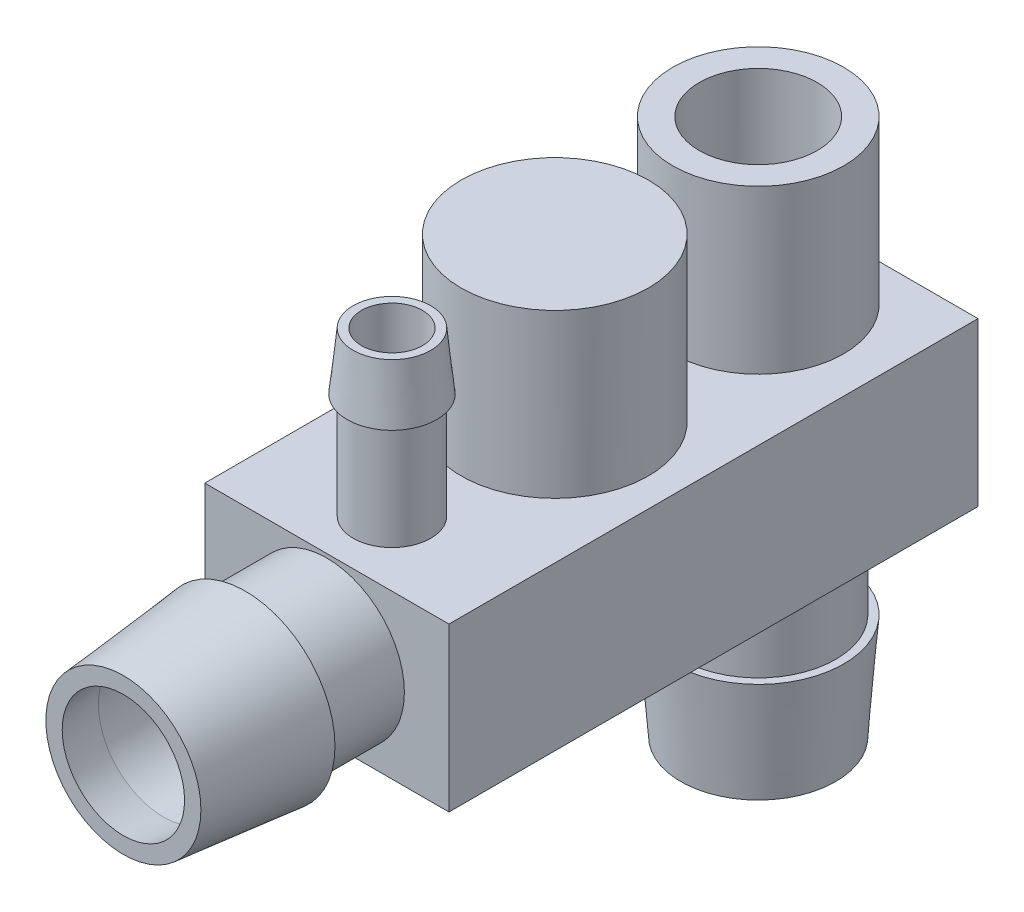
ISO-10303-21;
HEADER;
FILE_DESCRIPTION(('STEP AP214'),'2;1');
FILE_NAME('part.step','',(''),(''),'','','');
FILE_SCHEMA(('AUTOMOTIVE_DESIGN { 1 0 10303 214 1 1 1 1 }'));
ENDSEC;
DATA;
#1=APPLICATION_CONTEXT('core data for automotive mechanical design processes');
#2=APPLICATION_PROTOCOL_DEFINITION('international standard','automotive_design',2000,#1);
#3=PRODUCT_CONTEXT('',#1,'mechanical');
#4=PRODUCT('Part','Part','',(#3));
#5=PRODUCT_RELATED_PRODUCT_CATEGORY('part','',(#4));
#6=PRODUCT_DEFINITION_FORMATION('','',#4);
#7=PRODUCT_DEFINITION_CONTEXT('part definition',#1,'design');
#8=PRODUCT_DEFINITION('design','',#6,#7);
#9=PRODUCT_DEFINITION_SHAPE('','',#8);
#10=(LENGTH_UNIT() NAMED_UNIT(*) SI_UNIT(.MILLI.,.METRE.));
#11=(NAMED_UNIT(*) PLANE_ANGLE_UNIT() SI_UNIT($,.RADIAN.));
#12=(NAMED_UNIT(*) SI_UNIT($,.STERADIAN.) SOLID_ANGLE_UNIT());
#13=UNCERTAINTY_MEASURE_WITH_UNIT(LENGTH_MEASURE(1.E-05),#10,'distance_accuracy_value','');
#14=(GEOMETRIC_REPRESENTATION_CONTEXT(3) GLOBAL_UNCERTAINTY_ASSIGNED_CONTEXT((#13)) GLOBAL_UNIT_ASSIGNED_CONTEXT((#10,
#11,#12)) REPRESENTATION_CONTEXT('',''));
#15=CARTESIAN_POINT('',(0.,0.,0.));
#16=DIRECTION('',(0.,0.,1.));
#17=DIRECTION('',(1.,0.,0.));
#18=AXIS2_PLACEMENT_3D('',#15,#16,#17);
#19=CARTESIAN_POINT('',(0.,5.,4.49999999999999));
#20=DIRECTION('',(0.,1.,0.));
#21=DIRECTION('',(0.,0.,1.));
#22=AXIS2_PLACEMENT_3D('',#19,#20,#21);
#23=CYLINDRICAL_SURFACE('',#22,9.525);
#24=CARTESIAN_POINT('',(0.,8.,4.49999999999999));
#25=DIRECTION('',(0.,-1.,0.));
#26=DIRECTION('',(0.,0.,-1.));
#27=AXIS2_PLACEMENT_3D('',#24,#25,#26);
#28=CIRCLE('',#27,9.525);
#29=CARTESIAN_POINT('',(0.,8.,-5.02500000000001));
#30=VERTEX_POINT('',#29);
#31=EDGE_CURVE('E424',#30,#30,#28,.T.);
#32=ORIENTED_EDGE('',*,*,#31,.T.);
#33=EDGE_LOOP('',(#32));
#34=FACE_BOUND('',#33,.T.);
#35=CARTESIAN_POINT('',(0.,27.85,4.49999999999999));
#36=DIRECTION('',(0.,1.,0.));
#37=DIRECTION('',(0.,0.,1.));
#38=AXIS2_PLACEMENT_3D('',#35,#36,#37);
#39=CIRCLE('',#38,9.525);
#40=CARTESIAN_POINT('',(0.,27.85,14.025));
#41=VERTEX_POINT('',#40);
#42=EDGE_CURVE('E12',#41,#41,#39,.F.);
#43=ORIENTED_EDGE('',*,*,#42,.F.);
#44=EDGE_LOOP('',(#43));
#45=FACE_BOUND('',#44,.T.);
#46=ADVANCED_FACE('F40',(#34,#45),#23,.F.);
#47=CARTESIAN_POINT('',(0.,-36.,-20.5));
#48=DIRECTION('',(0.,1.,0.));
#49=DIRECTION('',(0.,0.,1.));
#50=AXIS2_PLACEMENT_3D('',#47,#48,#49);
#51=CYLINDRICAL_SURFACE('',#50,9.525);
#52=CARTESIAN_POINT('',(0.,-10.,-20.5));
#53=DIRECTION('',(0.,1.,0.));
#54=DIRECTION('',(0.,0.,1.));
#55=AXIS2_PLACEMENT_3D('',#52,#53,#54);
#56=CIRCLE('',#55,9.525);
#57=CARTESIAN_POINT('',(0.,-10.,-10.975));
#58=VERTEX_POINT('',#57);
#59=EDGE_CURVE('E202',#58,#58,#56,.F.);
#60=CARTESIAN_POINT('',(0.,-23.,-20.5));
#61=DIRECTION('',(0.,-1.,0.));
#62=DIRECTION('',(0.,0.,-1.));
#63=AXIS2_PLACEMENT_3D('',#60,#61,#62);
#64=CIRCLE('',#63,9.525);
#65=CARTESIAN_POINT('',(0.,-23.,-10.975));
#66=VERTEX_POINT('',#65);
#67=EDGE_CURVE('E48',#66,#66,#64,.T.);
#68=CARTESIAN_POINT('',(0.,-10.,-10.975));
#69=CARTESIAN_POINT('',(0.,-10.1354166666667,-10.975));
#70=CARTESIAN_POINT('',(0.,-10.2708333333333,-10.975));
#71=CARTESIAN_POINT('',(0.,-10.5416666666667,-10.975));
#72=CARTESIAN_POINT('',(0.,-10.6770833333333,-10.975));
#73=CARTESIAN_POINT('',(0.,-10.9479166666667,-10.975));
#74=CARTESIAN_POINT('',(0.,-11.0833333333333,-10.975));
#75=CARTESIAN_POINT('',(0.,-11.3541666666667,-10.975));
#76=CARTESIAN_POINT('',(0.,-11.4895833333333,-10.975));
#77=CARTESIAN_POINT('',(0.,-11.7604166666667,-10.975));
#78=CARTESIAN_POINT('',(0.,-11.8958333333333,-10.975));
#79=CARTESIAN_POINT('',(0.,-12.1666666666667,-10.975));
#80=CARTESIAN_POINT('',(0.,-12.3020833333333,-10.975));
#81=CARTESIAN_POINT('',(0.,-12.5729166666667,-10.975));
#82=CARTESIAN_POINT('',(0.,-12.7083333333333,-10.975));
#83=CARTESIAN_POINT('',(0.,-12.9791666666667,-10.975));
#84=CARTESIAN_POINT('',(0.,-13.1145833333333,-10.975));
#85=CARTESIAN_POINT('',(0.,-13.3854166666667,-10.975));
#86=CARTESIAN_POINT('',(0.,-13.5208333333333,-10.975));
#87=CARTESIAN_POINT('',(0.,-13.7916666666667,-10.975));
#88=CARTESIAN_POINT('',(0.,-13.9270833333333,-10.975));
#89=CARTESIAN_POINT('',(0.,-14.1979166666667,-10.975));
#90=CARTESIAN_POINT('',(0.,-14.3333333333333,-10.975));
#91=CARTESIAN_POINT('',(0.,-14.6041666666667,-10.975));
#92=CARTESIAN_POINT('',(0.,-14.7395833333333,-10.975));
#93=CARTESIAN_POINT('',(0.,-15.0104166666667,-10.975));
#94=CARTESIAN_POINT('',(0.,-15.1458333333333,-10.975));
#95=CARTESIAN_POINT('',(0.,-15.4166666666667,-10.975));
#96=CARTESIAN_POINT('',(0.,-15.5520833333333,-10.975));
#97=CARTESIAN_POINT('',(0.,-15.8229166666667,-10.975));
#98=CARTESIAN_POINT('',(0.,-15.9583333333333,-10.975));
#99=CARTESIAN_POINT('',(0.,-16.2291666666667,-10.975));
#100=CARTESIAN_POINT('',(0.,-16.3645833333333,-10.975));
#101=CARTESIAN_POINT('',(0.,-16.6354166666667,-10.975));
#102=CARTESIAN_POINT('',(0.,-16.7708333333333,-10.975));
#103=CARTESIAN_POINT('',(0.,-17.0416666666667,-10.975));
#104=CARTESIAN_POINT('',(0.,-17.1770833333333,-10.975));
#105=CARTESIAN_POINT('',(0.,-17.4479166666667,-10.975));
#106=CARTESIAN_POINT('',(0.,-17.5833333333333,-10.975));
#107=CARTESIAN_POINT('',(0.,-17.8541666666667,-10.975));
#108=CARTESIAN_POINT('',(0.,-17.9895833333333,-10.975));
#109=CARTESIAN_POINT('',(0.,-18.2604166666667,-10.975));
#110=CARTESIAN_POINT('',(0.,-18.3958333333333,-10.975));
#111=CARTESIAN_POINT('',(0.,-18.6666666666667,-10.975));
#112=CARTESIAN_POINT('',(0.,-18.8020833333333,-10.975));
#113=CARTESIAN_POINT('',(0.,-19.0729166666667,-10.975));
#114=CARTESIAN_POINT('',(0.,-19.2083333333333,-10.975));
#115=CARTESIAN_POINT('',(0.,-19.4791666666667,-10.975));
#116=CARTESIAN_POINT('',(0.,-19.6145833333333,-10.975));
#117=CARTESIAN_POINT('',(0.,-19.8854166666667,-10.975));
#118=CARTESIAN_POINT('',(0.,-20.0208333333333,-10.975));
#119=CARTESIAN_POINT('',(0.,-20.2916666666667,-10.975));
#120=CARTESIAN_POINT('',(0.,-20.4270833333333,-10.975));
#121=CARTESIAN_POINT('',(0.,-20.6979166666667,-10.975));
#122=CARTESIAN_POINT('',(0.,-20.8333333333333,-10.975));
#123=CARTESIAN_POINT('',(0.,-21.1041666666667,-10.975));
#124=CARTESIAN_POINT('',(0.,-21.2395833333333,-10.975));
#125=CARTESIAN_POINT('',(0.,-21.5104166666667,-10.975));
#126=CARTESIAN_POINT('',(0.,-21.6458333333333,-10.975));
#127=CARTESIAN_POINT('',(0.,-21.9166666666667,-10.975));
#128=CARTESIAN_POINT('',(0.,-22.0520833333333,-10.975));
#129=CARTESIAN_POINT('',(0.,-22.3229166666667,-10.975));
#130=CARTESIAN_POINT('',(0.,-22.4583333333333,-10.975));
#131=CARTESIAN_POINT('',(0.,-22.7291666666667,-10.975));
#132=CARTESIAN_POINT('',(0.,-22.8645833333333,-10.975));
#133=CARTESIAN_POINT('',(0.,-23.,-10.975));
#134=B_SPLINE_CURVE_WITH_KNOTS('',3,(#68,#69,#70,#71,#72,#73,#74,#75,#76,#77,#78,#79,#80,#81,
#82,#83,#84,#85,#86,#87,#88,#89,#90,#91,#92,#93,#94,#95,#96,#97,#98,#99,#100,#101,#102,#103,
#104,#105,#106,#107,#108,#109,#110,#111,#112,#113,#114,#115,#116,#117,#118,#119,#120,#121,#122,
#123,#124,#125,#126,#127,#128,#129,#130,#131,#132,#133),.UNSPECIFIED.,.F.,.F.,(4,2,2,2,2,2,2,2,
2,2,2,2,2,2,2,2,2,2,2,2,2,2,2,2,2,2,2,2,2,2,2,2,4),(0.,0.40625,0.812500000000001,1.21875,1.625,
2.03125,2.4375,2.84375,3.25,3.65625,4.0625,4.46875,4.875,5.28125,5.6875,6.09375,6.5,6.90625,
7.3125,7.71875,8.125,8.53125,8.93749999999999,9.34375,9.74999999999999,10.15625,10.5625,
10.96875,11.375,11.78125,12.1875,12.59375,13.),.UNSPECIFIED.);
#135=EDGE_CURVE('BSEAM255',#58,#66,#134,.T.);
#136=ORIENTED_EDGE('',*,*,#59,.T.);
#137=ORIENTED_EDGE('',*,*,#67,.F.);
#138=ORIENTED_EDGE('',*,*,#135,.T.);
#139=ORIENTED_EDGE('',*,*,#135,.F.);
#140=EDGE_LOOP('',(#136,#138,#137,#139));
#141=FACE_BOUND('',#140,.T.);
#142=ADVANCED_FACE('F255',(#141),#51,.T.);
#143=CARTESIAN_POINT('',(0.,1.,-20.5));
#144=DIRECTION('',(0.,-1.,0.));
#145=DIRECTION('',(0.,0.,-1.));
#146=AXIS2_PLACEMENT_3D('',#143,#144,#145);
#147=CYLINDRICAL_SURFACE('',#146,8.5);
#148=CARTESIAN_POINT('',(0.,-8.,-20.5));
#149=DIRECTION('',(0.,1.,0.));
#150=DIRECTION('',(0.,0.,1.));
#151=AXIS2_PLACEMENT_3D('',#148,#149,#150);
#152=CIRCLE('',#151,8.5);
#153=CARTESIAN_POINT('',(0.,-8.,-12.));
#154=VERTEX_POINT('',#153);
#155=EDGE_CURVE('E216',#154,#154,#152,.T.);
#156=ORIENTED_EDGE('',*,*,#155,.T.);
#157=EDGE_LOOP('',(#156));
#158=FACE_BOUND('',#157,.T.);
#159=CARTESIAN_POINT('',(0.,-23.,-20.5));
#160=DIRECTION('',(0.,-1.,0.));
#161=DIRECTION('',(0.,0.,-1.));
#162=AXIS2_PLACEMENT_3D('',#159,#160,#161);
#163=CIRCLE('',#162,8.5);
#164=CARTESIAN_POINT('',(0.,-23.,-29.));
#165=VERTEX_POINT('',#164);
#166=EDGE_CURVE('E204',#165,#165,#163,.F.);
#167=ORIENTED_EDGE('',*,*,#166,.F.);
#168=EDGE_LOOP('',(#167));
#169=FACE_BOUND('',#168,.T.);
#170=ADVANCED_FACE('F284',(#158,#169),#147,.F.);
#171=CARTESIAN_POINT('',(0.,30.,24.5));
#172=DIRECTION('',(0.,-1.,0.));
#173=DIRECTION('',(0.,0.,-1.));
#174=AXIS2_PLACEMENT_3D('',#171,#172,#173);
#175=CYLINDRICAL_SURFACE('',#174,4.7625);
#176=CARTESIAN_POINT('',(0.,10.,24.5));
#177=DIRECTION('',(0.,-1.,0.));
#178=DIRECTION('',(0.,0.,-1.));
#179=AXIS2_PLACEMENT_3D('',#176,#177,#178);
#180=CIRCLE('',#179,4.7625);
#181=CARTESIAN_POINT('',(0.,10.,19.7375));
#182=VERTEX_POINT('',#181);
#183=EDGE_CURVE('E190',#182,#182,#180,.F.);
#184=ORIENTED_EDGE('',*,*,#183,.T.);
#185=EDGE_LOOP('',(#184));
#186=FACE_BOUND('',#185,.T.);
#187=CARTESIAN_POINT('',(0.,23.,24.5));
#188=DIRECTION('',(0.,1.,0.));
#189=DIRECTION('',(0.,0.,1.));
#190=AXIS2_PLACEMENT_3D('',#187,#188,#189);
#191=CIRCLE('',#190,4.7625);
#192=CARTESIAN_POINT('',(0.,23.,29.2625));
#193=VERTEX_POINT('',#192);
#194=EDGE_CURVE('E199',#193,#193,#191,.T.);
#195=ORIENTED_EDGE('',*,*,#194,.F.);
#196=EDGE_LOOP('',(#195));
#197=FACE_BOUND('',#196,.T.);
#198=ADVANCED_FACE('F281',(#186,#197),#175,.T.);
#199=CARTESIAN_POINT('',(0.,0.,30.5));
#200=DIRECTION('',(0.,0.,1.));
#201=DIRECTION('',(1.,0.,0.));
#202=AXIS2_PLACEMENT_3D('',#199,#200,#201);
#203=CYLINDRICAL_SURFACE('',#202,8.);
#204=CARTESIAN_POINT('',(0.,0.,30.5));
#205=DIRECTION('',(0.,0.,1.));
#206=DIRECTION('',(1.,0.,0.));
#207=AXIS2_PLACEMENT_3D('',#204,#205,#206);
#208=CIRCLE('',#207,8.);
#209=CARTESIAN_POINT('',(0.,8.,30.5));
#210=VERTEX_POINT('',#209);
#211=CARTESIAN_POINT('',(0.,-8.,30.5));
#212=VERTEX_POINT('',#211);
#213=EDGE_CURVE('E54',#210,#212,#208,.T.);
#214=ORIENTED_EDGE('',*,*,#213,.F.);
#215=EDGE_CURVE('E130',#212,#210,#208,.T.);
#216=ORIENTED_EDGE('',*,*,#215,.F.);
#217=EDGE_LOOP('',(#214,#216));
#218=FACE_BOUND('',#217,.T.);
#219=CARTESIAN_POINT('',(0.,0.,52.5713947569169));
#220=DIRECTION('',(0.,0.,-1.));
#221=DIRECTION('',(-1.,0.,0.));
#222=AXIS2_PLACEMENT_3D('',#219,#220,#221);
#223=CIRCLE('',#222,8.);
#224=CARTESIAN_POINT('',(-8.,0.,52.5713947569169));
#225=VERTEX_POINT('',#224);
#226=EDGE_CURVE('E164',#225,#225,#223,.T.);
#227=ORIENTED_EDGE('',*,*,#226,.F.);
#228=EDGE_LOOP('',(#227));
#229=FACE_BOUND('',#228,.T.);
#230=ADVANCED_FACE('F131',(#218,#229),#203,.F.);
#231=CARTESIAN_POINT('',(0.,0.,30.5));
#232=DIRECTION('',(0.,0.,1.));
#233=DIRECTION('',(1.,0.,0.));
#234=AXIS2_PLACEMENT_3D('',#231,#232,#233);
#235=PLANE('',#234);
#236=DIRECTION('',(-1.,0.,0.));
#237=VECTOR('',#236,1.);
#238=CARTESIAN_POINT('',(-15.,8.,30.5));
#239=LINE('',#238,#237);
#240=CARTESIAN_POINT('',(-13.,8.,30.5));
#241=VERTEX_POINT('',#240);
#242=EDGE_CURVE('E144',#210,#241,#239,.T.);
#243=ORIENTED_EDGE('',*,*,#242,.F.);
#244=ORIENTED_EDGE('',*,*,#213,.T.);
#245=DIRECTION('',(1.,0.,0.));
#246=VECTOR('',#245,1.);
#247=CARTESIAN_POINT('',(-15.,-8.,30.5));
#248=LINE('',#247,#246);
#249=CARTESIAN_POINT('',(-13.,-8.,30.5));
#250=VERTEX_POINT('',#249);
#251=EDGE_CURVE('E143',#250,#212,#248,.T.);
#252=ORIENTED_EDGE('',*,*,#251,.F.);
#253=DIRECTION('',(0.,-1.,0.));
#254=VECTOR('',#253,1.);
#255=CARTESIAN_POINT('',(-13.,10.,30.5));
#256=LINE('',#255,#254);
#257=EDGE_CURVE('E155',#241,#250,#256,.T.);
#258=ORIENTED_EDGE('',*,*,#257,.F.);
#259=EDGE_LOOP('',(#243,#244,#252,#258));
#260=FACE_BOUND('',#259,.T.);
#261=ADVANCED_FACE('F140',(#260),#235,.F.);
#262=CARTESIAN_POINT('',(13.,10.,32.5));
#263=DIRECTION('',(-1.,0.,0.));
#264=DIRECTION('',(0.,0.,1.));
#265=AXIS2_PLACEMENT_3D('',#262,#263,#264);
#266=PLANE('',#265);
#267=DIRECTION('',(0.,1.,0.));
#268=VECTOR('',#267,1.);
#269=CARTESIAN_POINT('',(13.,10.,-30.5));
#270=LINE('',#269,#268);
#271=CARTESIAN_POINT('',(13.,-8.,-30.5));
#272=VERTEX_POINT('',#271);
#273=CARTESIAN_POINT('',(13.,8.,-30.5));
#274=VERTEX_POINT('',#273);
#275=EDGE_CURVE('E186',#272,#274,#270,.T.);
#276=ORIENTED_EDGE('',*,*,#275,.F.);
#277=DIRECTION('',(0.,0.,-1.));
#278=VECTOR('',#277,1.);
#279=CARTESIAN_POINT('',(13.,-8.,32.5));
#280=LINE('',#279,#278);
#281=CARTESIAN_POINT('',(13.,-8.,30.5));
#282=VERTEX_POINT('',#281);
#283=EDGE_CURVE('E184',#282,#272,#280,.T.);
#284=ORIENTED_EDGE('',*,*,#283,.F.);
#285=DIRECTION('',(0.,1.,0.));
#286=VECTOR('',#285,1.);
#287=CARTESIAN_POINT('',(13.,10.,30.5));
#288=LINE('',#287,#286);
#289=CARTESIAN_POINT('',(13.,8.,30.5));
#290=VERTEX_POINT('',#289);
#291=EDGE_CURVE('E151',#282,#290,#288,.T.);
#292=ORIENTED_EDGE('',*,*,#291,.T.);
#293=DIRECTION('',(0.,0.,-1.));
#294=VECTOR('',#293,1.);
#295=CARTESIAN_POINT('',(13.,8.,32.5));
#296=LINE('',#295,#294);
#297=EDGE_CURVE('E181',#290,#274,#296,.T.);
#298=ORIENTED_EDGE('',*,*,#297,.T.);
#299=EDGE_LOOP('',(#276,#284,#292,#298));
#300=FACE_BOUND('',#299,.T.);
#301=ADVANCED_FACE('F379',(#300),#266,.T.);
#302=CARTESIAN_POINT('',(-15.,8.,32.5));
#303=DIRECTION('',(0.,-1.,0.));
#304=DIRECTION('',(0.,0.,-1.));
#305=AXIS2_PLACEMENT_3D('',#302,#303,#304);
#306=PLANE('',#305);
#307=CARTESIAN_POINT('',(0.,8.,24.5));
#308=DIRECTION('',(0.,-1.,0.));
#309=DIRECTION('',(0.,0.,-1.));
#310=AXIS2_PLACEMENT_3D('',#307,#308,#309);
#311=CIRCLE('',#310,3.75);
#312=CARTESIAN_POINT('',(0.,8.,20.75));
#313=VERTEX_POINT('',#312);
#314=EDGE_CURVE('E421',#313,#313,#311,.T.);
#315=ORIENTED_EDGE('',*,*,#314,.F.);
#316=EDGE_LOOP('',(#315));
#317=FACE_BOUND('',#316,.T.);
#318=ORIENTED_EDGE('',*,*,#31,.F.);
#319=EDGE_LOOP('',(#318));
#320=FACE_BOUND('',#319,.T.);
#321=CARTESIAN_POINT('',(0.,8.,-20.5));
#322=DIRECTION('',(0.,-1.,0.));
#323=DIRECTION('',(0.,0.,-1.));
#324=AXIS2_PLACEMENT_3D('',#321,#322,#323);
#325=CIRCLE('',#324,7.25);
#326=CARTESIAN_POINT('',(0.,8.,-27.75));
#327=VERTEX_POINT('',#326);
#328=EDGE_CURVE('E427',#327,#327,#325,.T.);
#329=ORIENTED_EDGE('',*,*,#328,.F.);
#330=EDGE_LOOP('',(#329));
#331=FACE_BOUND('',#330,.T.);
#332=DIRECTION('',(-1.,0.,0.));
#333=VECTOR('',#332,1.);
#334=CARTESIAN_POINT('',(-15.,8.,-30.5));
#335=LINE('',#334,#333);
#336=CARTESIAN_POINT('',(-13.,8.,-30.5));
#337=VERTEX_POINT('',#336);
#338=EDGE_CURVE('E63',#274,#337,#335,.T.);
#339=ORIENTED_EDGE('',*,*,#338,.F.);
#340=ORIENTED_EDGE('',*,*,#297,.F.);
#341=EDGE_CURVE('E171',#290,#210,#239,.T.);
#342=ORIENTED_EDGE('',*,*,#341,.T.);
#343=ORIENTED_EDGE('',*,*,#242,.T.);
#344=DIRECTION('',(0.,0.,-1.));
#345=VECTOR('',#344,1.);
#346=CARTESIAN_POINT('',(-13.,8.,32.5));
#347=LINE('',#346,#345);
#348=EDGE_CURVE('E177',#241,#337,#347,.T.);
#349=ORIENTED_EDGE('',*,*,#348,.T.);
#350=EDGE_LOOP('',(#339,#340,#342,#343,#349));
#351=FACE_BOUND('',#350,.T.);
#352=ADVANCED_FACE('F382',(#317,#320,#331,#351),#306,.T.);
#353=CARTESIAN_POINT('',(-13.,10.,32.5));
#354=DIRECTION('',(1.,0.,0.));
#355=DIRECTION('',(0.,1.,0.));
#356=AXIS2_PLACEMENT_3D('',#353,#354,#355);
#357=PLANE('',#356);
#358=DIRECTION('',(0.,-1.,0.));
#359=VECTOR('',#358,1.);
#360=CARTESIAN_POINT('',(-13.,10.,-30.5));
#361=LINE('',#360,#359);
#362=CARTESIAN_POINT('',(-13.,-8.,-30.5));
#363=VERTEX_POINT('',#362);
#364=EDGE_CURVE('E179',#337,#363,#361,.T.);
#365=ORIENTED_EDGE('',*,*,#364,.F.);
#366=ORIENTED_EDGE('',*,*,#348,.F.);
#367=ORIENTED_EDGE('',*,*,#257,.T.);
#368=DIRECTION('',(0.,0.,-1.));
#369=VECTOR('',#368,1.);
#370=CARTESIAN_POINT('',(-13.,-8.,32.5));
#371=LINE('',#370,#369);
#372=EDGE_CURVE('E161',#250,#363,#371,.T.);
#373=ORIENTED_EDGE('',*,*,#372,.T.);
#374=EDGE_LOOP('',(#365,#366,#367,#373));
#375=FACE_BOUND('',#374,.T.);
#376=ADVANCED_FACE('F386',(#375),#357,.T.);
#377=CARTESIAN_POINT('',(-15.,-8.,32.5));
#378=DIRECTION('',(0.,1.,0.));
#379=DIRECTION('',(0.,0.,1.));
#380=AXIS2_PLACEMENT_3D('',#377,#378,#379);
#381=PLANE('',#380);
#382=ORIENTED_EDGE('',*,*,#155,.F.);
#383=EDGE_LOOP('',(#382));
#384=FACE_BOUND('',#383,.T.);
#385=DIRECTION('',(1.,0.,0.));
#386=VECTOR('',#385,1.);
#387=CARTESIAN_POINT('',(-15.,-8.,-30.5));
#388=LINE('',#387,#386);
#389=EDGE_CURVE('E175',#363,#272,#388,.T.);
#390=ORIENTED_EDGE('',*,*,#389,.F.);
#391=ORIENTED_EDGE('',*,*,#372,.F.);
#392=ORIENTED_EDGE('',*,*,#251,.T.);
#393=EDGE_CURVE('E148',#212,#282,#248,.T.);
#394=ORIENTED_EDGE('',*,*,#393,.T.);
#395=ORIENTED_EDGE('',*,*,#283,.T.);
#396=EDGE_LOOP('',(#390,#391,#392,#394,#395));
#397=FACE_BOUND('',#396,.T.);
#398=ADVANCED_FACE('F159',(#384,#397),#381,.T.);
#399=ORIENTED_EDGE('',*,*,#393,.F.);
#400=ORIENTED_EDGE('',*,*,#215,.T.);
#401=ORIENTED_EDGE('',*,*,#341,.F.);
#402=ORIENTED_EDGE('',*,*,#291,.F.);
#403=EDGE_LOOP('',(#399,#400,#401,#402));
#404=FACE_BOUND('',#403,.T.);
#405=ADVANCED_FACE('F149',(#404),#235,.F.);
#406=CARTESIAN_POINT('',(0.,0.,-30.5));
#407=DIRECTION('',(0.,0.,1.));
#408=DIRECTION('',(1.,0.,0.));
#409=AXIS2_PLACEMENT_3D('',#406,#407,#408);
#410=PLANE('',#409);
#411=ORIENTED_EDGE('',*,*,#275,.T.);
#412=ORIENTED_EDGE('',*,*,#338,.T.);
#413=ORIENTED_EDGE('',*,*,#364,.T.);
#414=ORIENTED_EDGE('',*,*,#389,.T.);
#415=EDGE_LOOP('',(#411,#412,#413,#414));
#416=FACE_BOUND('',#415,.T.);
#417=ADVANCED_FACE('F42',(#416),#410,.T.);
#418=CARTESIAN_POINT('',(0.,0.,57.304277321645));
#419=DIRECTION('',(0.,0.,-1.));
#420=DIRECTION('',(-1.,0.,0.));
#421=AXIS2_PLACEMENT_3D('',#418,#419,#420);
#422=CONICAL_SURFACE('',#421,7.53459988113507,0.0980182166238236);
#423=CARTESIAN_POINT('',(0.,0.,57.5));
#424=DIRECTION('',(0.,0.,1.));
#425=DIRECTION('',(1.,0.,0.));
#426=AXIS2_PLACEMENT_3D('',#423,#424,#425);
#427=CIRCLE('',#426,7.51535381776349);
#428=CARTESIAN_POINT('',(7.51535381776349,0.,57.5));
#429=VERTEX_POINT('',#428);
#430=EDGE_CURVE('E326',#429,#429,#427,.F.);
#431=ORIENTED_EDGE('',*,*,#430,.F.);
#432=EDGE_LOOP('',(#431));
#433=FACE_BOUND('',#432,.T.);
#434=ORIENTED_EDGE('',*,*,#226,.T.);
#435=EDGE_LOOP('',(#434));
#436=FACE_BOUND('',#435,.T.);
#437=ADVANCED_FACE('F286',(#433,#436),#422,.F.);
#438=CARTESIAN_POINT('',(0.,0.,57.5));
#439=DIRECTION('',(0.,0.,1.));
#440=DIRECTION('',(1.,0.,0.));
#441=AXIS2_PLACEMENT_3D('',#438,#439,#440);
#442=PLANE('',#441);
#443=CARTESIAN_POINT('',(0.,0.,57.5));
#444=DIRECTION('',(0.,0.,1.));
#445=DIRECTION('',(1.,0.,0.));
#446=AXIS2_PLACEMENT_3D('',#443,#444,#445);
#447=CIRCLE('',#446,9.525);
#448=CARTESIAN_POINT('',(9.525,0.,57.5));
#449=VERTEX_POINT('',#448);
#450=EDGE_CURVE('E318',#449,#449,#447,.F.);
#451=ORIENTED_EDGE('',*,*,#450,.F.);
#452=EDGE_LOOP('',(#451));
#453=FACE_BOUND('',#452,.T.);
#454=ORIENTED_EDGE('',*,*,#430,.T.);
#455=EDGE_LOOP('',(#454));
#456=FACE_BOUND('',#455,.T.);
#457=ADVANCED_FACE('F289',(#453,#456),#442,.T.);
#458=CARTESIAN_POINT('',(0.,0.,42.5));
#459=DIRECTION('',(0.,0.,1.));
#460=DIRECTION('',(1.,0.,0.));
#461=AXIS2_PLACEMENT_3D('',#458,#459,#460);
#462=PLANE('',#461);
#463=CARTESIAN_POINT('',(0.,0.,42.5));
#464=DIRECTION('',(0.,0.,1.));
#465=DIRECTION('',(1.,0.,0.));
#466=AXIS2_PLACEMENT_3D('',#463,#464,#465);
#467=CIRCLE('',#466,9.525);
#468=CARTESIAN_POINT('',(9.525,0.,42.5));
#469=VERTEX_POINT('',#468);
#470=EDGE_CURVE('E162',#469,#469,#467,.T.);
#471=ORIENTED_EDGE('',*,*,#470,.T.);
#472=EDGE_LOOP('',(#471));
#473=FACE_BOUND('',#472,.T.);
#474=CARTESIAN_POINT('',(0.,0.,42.5));
#475=DIRECTION('',(0.,0.,1.));
#476=DIRECTION('',(1.,0.,0.));
#477=AXIS2_PLACEMENT_3D('',#474,#475,#476);
#478=CIRCLE('',#477,11.);
#479=CARTESIAN_POINT('',(11.,0.,42.5));
#480=VERTEX_POINT('',#479);
#481=EDGE_CURVE('E314',#480,#480,#478,.T.);
#482=ORIENTED_EDGE('',*,*,#481,.F.);
#483=EDGE_LOOP('',(#482));
#484=FACE_BOUND('',#483,.T.);
#485=ADVANCED_FACE('F291',(#473,#484),#462,.F.);
#486=CARTESIAN_POINT('',(0.,0.,57.5));
#487=DIRECTION('',(0.,0.,-1.));
#488=DIRECTION('',(-1.,0.,0.));
#489=AXIS2_PLACEMENT_3D('',#486,#487,#488);
#490=CONICAL_SURFACE('',#489,9.525,0.0980182166238236);
#491=ORIENTED_EDGE('',*,*,#450,.T.);
#492=EDGE_LOOP('',(#491));
#493=FACE_BOUND('',#492,.T.);
#494=ORIENTED_EDGE('',*,*,#481,.T.);
#495=EDGE_LOOP('',(#494));
#496=FACE_BOUND('',#495,.T.);
#497=ADVANCED_FACE('F295',(#493,#496),#490,.T.);
#498=CARTESIAN_POINT('',(0.,0.,-32.5));
#499=DIRECTION('',(0.,0.,1.));
#500=DIRECTION('',(1.,0.,0.));
#501=AXIS2_PLACEMENT_3D('',#498,#499,#500);
#502=PLANE('',#501);
#503=DIRECTION('',(0.,1.,0.));
#504=VECTOR('',#503,1.);
#505=CARTESIAN_POINT('',(15.,10.,-32.5));
#506=LINE('',#505,#504);
#507=CARTESIAN_POINT('',(15.,-10.,-32.5));
#508=VERTEX_POINT('',#507);
#509=CARTESIAN_POINT('',(15.,10.,-32.5));
#510=VERTEX_POINT('',#509);
#511=EDGE_CURVE('E146',#508,#510,#506,.T.);
#512=ORIENTED_EDGE('',*,*,#511,.F.);
#513=DIRECTION('',(1.,0.,0.));
#514=VECTOR('',#513,1.);
#515=CARTESIAN_POINT('',(-15.,-10.,-32.5));
#516=LINE('',#515,#514);
#517=CARTESIAN_POINT('',(-15.,-10.,-32.5));
#518=VERTEX_POINT('',#517);
#519=EDGE_CURVE('E120',#518,#508,#516,.T.);
#520=ORIENTED_EDGE('',*,*,#519,.F.);
#521=DIRECTION('',(0.,-1.,0.));
#522=VECTOR('',#521,1.);
#523=CARTESIAN_POINT('',(-15.,10.,-32.5));
#524=LINE('',#523,#522);
#525=CARTESIAN_POINT('',(-15.,10.,-32.5));
#526=VERTEX_POINT('',#525);
#527=EDGE_CURVE('E114',#526,#518,#524,.T.);
#528=ORIENTED_EDGE('',*,*,#527,.F.);
#529=DIRECTION('',(-1.,0.,0.));
#530=VECTOR('',#529,1.);
#531=CARTESIAN_POINT('',(-15.,10.,-32.5));
#532=LINE('',#531,#530);
#533=EDGE_CURVE('E341',#510,#526,#532,.T.);
#534=ORIENTED_EDGE('',*,*,#533,.F.);
#535=EDGE_LOOP('',(#512,#520,#528,#534));
#536=FACE_BOUND('',#535,.T.);
#537=ADVANCED_FACE('F356',(#536),#502,.F.);
#538=CARTESIAN_POINT('',(-15.,-10.,32.5));
#539=DIRECTION('',(0.,1.,0.));
#540=DIRECTION('',(0.,0.,1.));
#541=AXIS2_PLACEMENT_3D('',#538,#539,#540);
#542=PLANE('',#541);
#543=ORIENTED_EDGE('',*,*,#59,.F.);
#544=EDGE_LOOP('',(#543));
#545=FACE_BOUND('',#544,.T.);
#546=ORIENTED_EDGE('',*,*,#519,.T.);
#547=DIRECTION('',(0.,0.,-1.));
#548=VECTOR('',#547,1.);
#549=CARTESIAN_POINT('',(15.,-10.,32.5));
#550=LINE('',#549,#548);
#551=CARTESIAN_POINT('',(15.,-10.,32.5));
#552=VERTEX_POINT('',#551);
#553=EDGE_CURVE('E338',#552,#508,#550,.T.);
#554=ORIENTED_EDGE('',*,*,#553,.F.);
#555=DIRECTION('',(1.,0.,0.));
#556=VECTOR('',#555,1.);
#557=CARTESIAN_POINT('',(-15.,-10.,32.5));
#558=LINE('',#557,#556);
#559=CARTESIAN_POINT('',(-15.,-10.,32.5));
#560=VERTEX_POINT('',#559);
#561=EDGE_CURVE('E96',#560,#552,#558,.T.);
#562=ORIENTED_EDGE('',*,*,#561,.F.);
#563=DIRECTION('',(0.,0.,-1.));
#564=VECTOR('',#563,1.);
#565=CARTESIAN_POINT('',(-15.,-10.,32.5));
#566=LINE('',#565,#564);
#567=EDGE_CURVE('E346',#560,#518,#566,.T.);
#568=ORIENTED_EDGE('',*,*,#567,.T.);
#569=EDGE_LOOP('',(#546,#554,#562,#568));
#570=FACE_BOUND('',#569,.T.);
#571=ADVANCED_FACE('F358',(#545,#570),#542,.F.);
#572=CARTESIAN_POINT('',(-15.,10.,32.5));
#573=DIRECTION('',(1.,0.,0.));
#574=DIRECTION('',(0.,1.,0.));
#575=AXIS2_PLACEMENT_3D('',#572,#573,#574);
#576=PLANE('',#575);
#577=ORIENTED_EDGE('',*,*,#527,.T.);
#578=ORIENTED_EDGE('',*,*,#567,.F.);
#579=DIRECTION('',(0.,-1.,0.));
#580=VECTOR('',#579,1.);
#581=CARTESIAN_POINT('',(-15.,10.,32.5));
#582=LINE('',#581,#580);
#583=CARTESIAN_POINT('',(-15.,10.,32.5));
#584=VERTEX_POINT('',#583);
#585=EDGE_CURVE('E335',#584,#560,#582,.T.);
#586=ORIENTED_EDGE('',*,*,#585,.F.);
#587=DIRECTION('',(0.,0.,-1.));
#588=VECTOR('',#587,1.);
#589=CARTESIAN_POINT('',(-15.,10.,32.5));
#590=LINE('',#589,#588);
#591=EDGE_CURVE('E347',#584,#526,#590,.T.);
#592=ORIENTED_EDGE('',*,*,#591,.T.);
#593=EDGE_LOOP('',(#577,#578,#586,#592));
#594=FACE_BOUND('',#593,.T.);
#595=ADVANCED_FACE('F364',(#594),#576,.F.);
#596=CARTESIAN_POINT('',(-15.,10.,32.5));
#597=DIRECTION('',(0.,-1.,0.));
#598=DIRECTION('',(0.,0.,-1.));
#599=AXIS2_PLACEMENT_3D('',#596,#597,#598);
#600=PLANE('',#599);
#601=CARTESIAN_POINT('',(0.,10.,-20.5));
#602=DIRECTION('',(0.,-1.,0.));
#603=DIRECTION('',(0.,0.,-1.));
#604=AXIS2_PLACEMENT_3D('',#601,#602,#603);
#605=CIRCLE('',#604,10.5);
#606=CARTESIAN_POINT('',(0.,10.,-31.));
#607=VERTEX_POINT('',#606);
#608=EDGE_CURVE('E196',#607,#607,#605,.F.);
#609=ORIENTED_EDGE('',*,*,#608,.F.);
#610=EDGE_LOOP('',(#609));
#611=FACE_BOUND('',#610,.T.);
#612=CARTESIAN_POINT('',(0.,10.,4.49999999999999));
#613=DIRECTION('',(0.,-1.,0.));
#614=DIRECTION('',(0.,0.,-1.));
#615=AXIS2_PLACEMENT_3D('',#612,#613,#614);
#616=CIRCLE('',#615,11.5);
#617=CARTESIAN_POINT('',(0.,10.,-7.00000000000001));
#618=VERTEX_POINT('',#617);
#619=EDGE_CURVE('E193',#618,#618,#616,.F.);
#620=ORIENTED_EDGE('',*,*,#619,.F.);
#621=EDGE_LOOP('',(#620));
#622=FACE_BOUND('',#621,.T.);
#623=ORIENTED_EDGE('',*,*,#183,.F.);
#624=EDGE_LOOP('',(#623));
#625=FACE_BOUND('',#624,.T.);
#626=ORIENTED_EDGE('',*,*,#533,.T.);
#627=ORIENTED_EDGE('',*,*,#591,.F.);
#628=DIRECTION('',(-1.,0.,0.));
#629=VECTOR('',#628,1.);
#630=CARTESIAN_POINT('',(-15.,10.,32.5));
#631=LINE('',#630,#629);
#632=CARTESIAN_POINT('',(15.,10.,32.5));
#633=VERTEX_POINT('',#632);
#634=EDGE_CURVE('E128',#633,#584,#631,.T.);
#635=ORIENTED_EDGE('',*,*,#634,.F.);
#636=DIRECTION('',(0.,0.,-1.));
#637=VECTOR('',#636,1.);
#638=CARTESIAN_POINT('',(15.,10.,32.5));
#639=LINE('',#638,#637);
#640=EDGE_CURVE('E168',#633,#510,#639,.T.);
#641=ORIENTED_EDGE('',*,*,#640,.T.);
#642=EDGE_LOOP('',(#626,#627,#635,#641));
#643=FACE_BOUND('',#642,.T.);
#644=ADVANCED_FACE('F350',(#611,#622,#625,#643),#600,.F.);
#645=CARTESIAN_POINT('',(15.,10.,32.5));
#646=DIRECTION('',(-1.,0.,0.));
#647=DIRECTION('',(0.,0.,1.));
#648=AXIS2_PLACEMENT_3D('',#645,#646,#647);
#649=PLANE('',#648);
#650=ORIENTED_EDGE('',*,*,#511,.T.);
#651=ORIENTED_EDGE('',*,*,#640,.F.);
#652=DIRECTION('',(0.,1.,0.));
#653=VECTOR('',#652,1.);
#654=CARTESIAN_POINT('',(15.,10.,32.5));
#655=LINE('',#654,#653);
#656=EDGE_CURVE('E332',#552,#633,#655,.T.);
#657=ORIENTED_EDGE('',*,*,#656,.F.);
#658=ORIENTED_EDGE('',*,*,#553,.T.);
#659=EDGE_LOOP('',(#650,#651,#657,#658));
#660=FACE_BOUND('',#659,.T.);
#661=ADVANCED_FACE('F354',(#660),#649,.F.);
#662=CARTESIAN_POINT('',(0.,0.,32.5));
#663=DIRECTION('',(0.,0.,1.));
#664=DIRECTION('',(1.,0.,0.));
#665=AXIS2_PLACEMENT_3D('',#662,#663,#664);
#666=PLANE('',#665);
#667=ORIENTED_EDGE('',*,*,#656,.T.);
#668=ORIENTED_EDGE('',*,*,#634,.T.);
#669=ORIENTED_EDGE('',*,*,#585,.T.);
#670=ORIENTED_EDGE('',*,*,#561,.T.);
#671=EDGE_LOOP('',(#667,#668,#669,#670));
#672=FACE_BOUND('',#671,.T.);
#673=CARTESIAN_POINT('',(0.,0.,32.5));
#674=DIRECTION('',(0.,0.,1.));
#675=DIRECTION('',(1.,0.,0.));
#676=AXIS2_PLACEMENT_3D('',#673,#674,#675);
#677=CIRCLE('',#676,9.525);
#678=CARTESIAN_POINT('',(9.525,0.,32.5));
#679=VERTEX_POINT('',#678);
#680=EDGE_CURVE('E136',#679,#679,#677,.T.);
#681=ORIENTED_EDGE('',*,*,#680,.F.);
#682=EDGE_LOOP('',(#681));
#683=FACE_BOUND('',#682,.T.);
#684=ADVANCED_FACE('F369',(#672,#683),#666,.T.);
#685=CARTESIAN_POINT('',(0.,0.,57.5));
#686=DIRECTION('',(0.,0.,-1.));
#687=DIRECTION('',(-1.,0.,0.));
#688=AXIS2_PLACEMENT_3D('',#685,#686,#687);
#689=CYLINDRICAL_SURFACE('',#688,9.525);
#690=ORIENTED_EDGE('',*,*,#680,.T.);
#691=EDGE_LOOP('',(#690));
#692=FACE_BOUND('',#691,.T.);
#693=ORIENTED_EDGE('',*,*,#470,.F.);
#694=EDGE_LOOP('',(#693));
#695=FACE_BOUND('',#694,.T.);
#696=ADVANCED_FACE('F279',(#692,#695),#689,.T.);
#697=CARTESIAN_POINT('',(0.,30.,24.5));
#698=DIRECTION('',(0.,1.,0.));
#699=DIRECTION('',(0.,0.,1.));
#700=AXIS2_PLACEMENT_3D('',#697,#698,#699);
#701=PLANE('',#700);
#702=CARTESIAN_POINT('',(0.,30.,24.5));
#703=DIRECTION('',(0.,1.,0.));
#704=DIRECTION('',(0.,0.,1.));
#705=AXIS2_PLACEMENT_3D('',#702,#703,#704);
#706=CIRCLE('',#705,4.7625);
#707=CARTESIAN_POINT('',(4.09317800842647,30.,26.9346046991932));
#708=VERTEX_POINT('',#707);
#709=EDGE_CURVE('E219',#708,#708,#706,.F.);
#710=ORIENTED_EDGE('',*,*,#709,.F.);
#711=EDGE_LOOP('',(#710));
#712=FACE_BOUND('',#711,.T.);
#713=CARTESIAN_POINT('',(0.,30.,24.5));
#714=DIRECTION('',(0.,1.,0.));
#715=DIRECTION('',(0.,0.,1.));
#716=AXIS2_PLACEMENT_3D('',#713,#714,#715);
#717=CIRCLE('',#716,3.75);
#718=CARTESIAN_POINT('',(0.,30.,28.25));
#719=VERTEX_POINT('',#718);
#720=EDGE_CURVE('E430',#719,#719,#717,.T.);
#721=ORIENTED_EDGE('',*,*,#720,.F.);
#722=EDGE_LOOP('',(#721));
#723=FACE_BOUND('',#722,.T.);
#724=ADVANCED_FACE('F275',(#712,#723),#701,.T.);
#725=CARTESIAN_POINT('',(0.,30.,4.49999999999999));
#726=DIRECTION('',(0.,-1.,0.));
#727=DIRECTION('',(0.,0.,-1.));
#728=AXIS2_PLACEMENT_3D('',#725,#726,#727);
#729=CYLINDRICAL_SURFACE('',#728,11.5);
#730=CARTESIAN_POINT('',(0.,30.,4.49999999999999));
#731=DIRECTION('',(0.,1.,0.));
#732=DIRECTION('',(0.,0.,1.));
#733=AXIS2_PLACEMENT_3D('',#730,#731,#732);
#734=CIRCLE('',#733,11.5);
#735=CARTESIAN_POINT('',(0.,30.,16.));
#736=VERTEX_POINT('',#735);
#737=EDGE_CURVE('E414',#736,#736,#734,.T.);
#738=ORIENTED_EDGE('',*,*,#737,.F.);
#739=EDGE_LOOP('',(#738));
#740=FACE_BOUND('',#739,.T.);
#741=ORIENTED_EDGE('',*,*,#619,.T.);
#742=EDGE_LOOP('',(#741));
#743=FACE_BOUND('',#742,.T.);
#744=ADVANCED_FACE('F271',(#740,#743),#729,.T.);
#745=CARTESIAN_POINT('',(0.,30.,4.49999999999999));
#746=DIRECTION('',(0.,1.,0.));
#747=DIRECTION('',(0.,0.,1.));
#748=AXIS2_PLACEMENT_3D('',#745,#746,#747);
#749=PLANE('',#748);
#750=ORIENTED_EDGE('',*,*,#737,.T.);
#751=EDGE_LOOP('',(#750));
#752=FACE_BOUND('',#751,.T.);
#753=ADVANCED_FACE('F267',(#752),#749,.T.);
#754=CARTESIAN_POINT('',(0.,30.,-20.5));
#755=DIRECTION('',(0.,-1.,0.));
#756=DIRECTION('',(0.,0.,-1.));
#757=AXIS2_PLACEMENT_3D('',#754,#755,#756);
#758=CYLINDRICAL_SURFACE('',#757,10.5);
#759=CARTESIAN_POINT('',(0.,30.,-20.5));
#760=DIRECTION('',(0.,1.,0.));
#761=DIRECTION('',(0.,0.,1.));
#762=AXIS2_PLACEMENT_3D('',#759,#760,#761);
#763=CIRCLE('',#762,10.5);
#764=CARTESIAN_POINT('',(0.,30.,-10.));
#765=VERTEX_POINT('',#764);
#766=EDGE_CURVE('E416',#765,#765,#763,.T.);
#767=ORIENTED_EDGE('',*,*,#766,.F.);
#768=EDGE_LOOP('',(#767));
#769=FACE_BOUND('',#768,.T.);
#770=ORIENTED_EDGE('',*,*,#608,.T.);
#771=EDGE_LOOP('',(#770));
#772=FACE_BOUND('',#771,.T.);
#773=ADVANCED_FACE('F263',(#769,#772),#758,.T.);
#774=CARTESIAN_POINT('',(0.,30.,-20.5));
#775=DIRECTION('',(0.,1.,0.));
#776=DIRECTION('',(0.,0.,1.));
#777=AXIS2_PLACEMENT_3D('',#774,#775,#776);
#778=PLANE('',#777);
#779=CARTESIAN_POINT('',(0.,30.,-20.5));
#780=DIRECTION('',(0.,1.,0.));
#781=DIRECTION('',(0.,0.,1.));
#782=AXIS2_PLACEMENT_3D('',#779,#780,#781);
#783=CIRCLE('',#782,7.25);
#784=CARTESIAN_POINT('',(0.,30.,-13.25));
#785=VERTEX_POINT('',#784);
#786=EDGE_CURVE('E431',#785,#785,#783,.T.);
#787=ORIENTED_EDGE('',*,*,#786,.F.);
#788=EDGE_LOOP('',(#787));
#789=FACE_BOUND('',#788,.T.);
#790=ORIENTED_EDGE('',*,*,#766,.T.);
#791=EDGE_LOOP('',(#790));
#792=FACE_BOUND('',#791,.T.);
#793=ADVANCED_FACE('F259',(#789,#792),#778,.T.);
#794=CARTESIAN_POINT('',(0.,5.,-20.5));
#795=DIRECTION('',(0.,1.,0.));
#796=DIRECTION('',(0.,0.,1.));
#797=AXIS2_PLACEMENT_3D('',#794,#795,#796);
#798=CYLINDRICAL_SURFACE('',#797,7.25);
#799=ORIENTED_EDGE('',*,*,#328,.T.);
#800=EDGE_LOOP('',(#799));
#801=FACE_BOUND('',#800,.T.);
#802=ORIENTED_EDGE('',*,*,#786,.T.);
#803=EDGE_LOOP('',(#802));
#804=FACE_BOUND('',#803,.T.);
#805=ADVANCED_FACE('F251',(#801,#804),#798,.F.);
#806=CARTESIAN_POINT('',(0.,5.,24.5));
#807=DIRECTION('',(0.,1.,0.));
#808=DIRECTION('',(0.,0.,1.));
#809=AXIS2_PLACEMENT_3D('',#806,#807,#808);
#810=CYLINDRICAL_SURFACE('',#809,3.75);
#811=ORIENTED_EDGE('',*,*,#314,.T.);
#812=EDGE_LOOP('',(#811));
#813=FACE_BOUND('',#812,.T.);
#814=ORIENTED_EDGE('',*,*,#720,.T.);
#815=EDGE_LOOP('',(#814));
#816=FACE_BOUND('',#815,.T.);
#817=ADVANCED_FACE('F248',(#813,#816),#810,.F.);
#818=CARTESIAN_POINT('',(4.09226937219681,30.092463157073,26.9192696542274));
#819=CARTESIAN_POINT('',(4.09317800842647,30.,26.9346046991933));
#820=CARTESIAN_POINT('',(4.1619670678639,23.,28.0955569980208));
#821=CARTESIAN_POINT('',(-0.746269936258066,30.092463157073,35.103808398621));
#822=CARTESIAN_POINT('',(-0.776031389960036,30.,35.1209607160462));
#823=CARTESIAN_POINT('',(-3.0291469281777,23.,36.4194911337486));
#824=CARTESIAN_POINT('',(-8.93080868065168,30.092463157073,30.2652690901662));
#825=CARTESIAN_POINT('',(-8.96238740681298,30.,30.2517513176597));
#826=CARTESIAN_POINT('',(-11.3530810639055,23.,29.228377137707));
#827=CARTESIAN_POINT('',(-4.09226937219681,30.092463157073,22.0807303457726));
#828=CARTESIAN_POINT('',(-4.09317800842647,30.,22.0653953008067));
#829=CARTESIAN_POINT('',(-4.1619670678639,23.,20.9044430019792));
#830=CARTESIAN_POINT('',(0.746269936258067,30.092463157073,13.8961916013789));
#831=CARTESIAN_POINT('',(0.776031389960037,30.,13.8790392839538));
#832=CARTESIAN_POINT('',(3.0291469281777,23.,12.5805088662514));
#833=CARTESIAN_POINT('',(8.93080868065168,30.092463157073,18.7347309098338));
#834=CARTESIAN_POINT('',(8.96238740681298,30.,18.7482486823403));
#835=CARTESIAN_POINT('',(11.3530810639055,23.,19.771622862293));
#836=CARTESIAN_POINT('',(4.09226937219681,30.092463157073,26.9192696542274));
#837=CARTESIAN_POINT('',(4.09317800842647,30.,26.9346046991933));
#838=CARTESIAN_POINT('',(4.1619670678639,23.,28.0955569980208));
#839=(BOUNDED_SURFACE() B_SPLINE_SURFACE(3,1,((#818,#819,#820),(#821,#822,#823),(#824,#825,
#826),(#827,#828,#829),(#830,#831,#832),(#833,#834,#835),(#836,#837,#838)),.UNSPECIFIED.,.T.,
.F.,.F.) B_SPLINE_SURFACE_WITH_KNOTS((4,3,4),(2,1,2),(0.,0.5,1.),(-0.013209022438997,0.,1.),
.UNSPECIFIED.) GEOMETRIC_REPRESENTATION_ITEM() RATIONAL_B_SPLINE_SURFACE(((1.,1.,1.),
(0.333333333333333,0.333333333333333,0.333333333333333),(0.333333333333333,0.333333333333333,
0.333333333333333),(1.,1.,1.),(0.333333333333333,0.333333333333333,0.333333333333333),
(0.333333333333333,0.333333333333333,0.333333333333333),(1.,1.,1.))) REPRESENTATION_ITEM('') SURFACE());
#840=CARTESIAN_POINT('',(0.,23.,24.5));
#841=DIRECTION('',(0.,1.,0.));
#842=DIRECTION('',(0.,0.,1.));
#843=AXIS2_PLACEMENT_3D('',#840,#841,#842);
#844=CIRCLE('',#843,5.5);
#845=CARTESIAN_POINT('',(4.1619670678639,23.,28.0955569980208));
#846=VERTEX_POINT('',#845);
#847=EDGE_CURVE('E225',#846,#846,#844,.T.);
#848=CARTESIAN_POINT('',(4.09317800842647,30.,26.9346046991932));
#849=CARTESIAN_POINT('',(4.09389456112895,29.9270833333333,26.946697952306));
#850=CARTESIAN_POINT('',(4.09461111383142,29.8541666666667,26.9587912054188));
#851=CARTESIAN_POINT('',(4.09604421923637,29.7083333333333,26.9829777116444));
#852=CARTESIAN_POINT('',(4.09676077193884,29.6354166666667,26.9950709647572));
#853=CARTESIAN_POINT('',(4.09819387734379,29.4895833333333,27.0192574709828));
#854=CARTESIAN_POINT('',(4.09891043004626,29.4166666666667,27.0313507240955));
#855=CARTESIAN_POINT('',(4.10034353545121,29.2708333333333,27.0555372303211));
#856=CARTESIAN_POINT('',(4.10106008815368,29.1979166666667,27.0676304834339));
#857=CARTESIAN_POINT('',(4.10249319355863,29.0520833333333,27.0918169896595));
#858=CARTESIAN_POINT('',(4.1032097462611,28.9791666666667,27.1039102427723));
#859=CARTESIAN_POINT('',(4.10464285166604,28.8333333333333,27.1280967489978));
#860=CARTESIAN_POINT('',(4.10535940436852,28.7604166666667,27.1401900021106));
#861=CARTESIAN_POINT('',(4.10679250977346,28.6145833333333,27.1643765083362));
#862=CARTESIAN_POINT('',(4.10750906247594,28.5416666666667,27.176469761449));
#863=CARTESIAN_POINT('',(4.10894216788088,28.3958333333333,27.2006562676746));
#864=CARTESIAN_POINT('',(4.10965872058336,28.3229166666667,27.2127495207874));
#865=CARTESIAN_POINT('',(4.1110918259883,28.1770833333333,27.2369360270129));
#866=CARTESIAN_POINT('',(4.11180837869078,28.1041666666667,27.2490292801257));
#867=CARTESIAN_POINT('',(4.11324148409572,27.9583333333333,27.2732157863513));
#868=CARTESIAN_POINT('',(4.1139580367982,27.8854166666667,27.2853090394641));
#869=CARTESIAN_POINT('',(4.11539114220314,27.7395833333333,27.3094955456896));
#870=CARTESIAN_POINT('',(4.11610769490562,27.6666666666667,27.3215887988024));
#871=CARTESIAN_POINT('',(4.11754080031056,27.5208333333333,27.345775305028));
#872=CARTESIAN_POINT('',(4.11825735301304,27.4479166666667,27.3578685581408));
#873=CARTESIAN_POINT('',(4.11969045841798,27.3020833333333,27.3820550643664));
#874=CARTESIAN_POINT('',(4.12040701112046,27.2291666666667,27.3941483174792));
#875=CARTESIAN_POINT('',(4.1218401165254,27.0833333333333,27.4183348237047));
#876=CARTESIAN_POINT('',(4.12255666922788,27.0104166666667,27.4304280768175));
#877=CARTESIAN_POINT('',(4.12398977463282,26.8645833333333,27.4546145830431));
#878=CARTESIAN_POINT('',(4.12470632733529,26.7916666666667,27.4667078361559));
#879=CARTESIAN_POINT('',(4.12613943274024,26.6458333333333,27.4908943423814));
#880=CARTESIAN_POINT('',(4.12685598544271,26.5729166666667,27.5029875954942));
#881=CARTESIAN_POINT('',(4.12828909084766,26.4270833333333,27.5271741017198));
#882=CARTESIAN_POINT('',(4.12900564355013,26.3541666666667,27.5392673548326));
#883=CARTESIAN_POINT('',(4.13043874895508,26.2083333333333,27.5634538610582));
#884=CARTESIAN_POINT('',(4.13115530165755,26.1354166666667,27.575547114171));
#885=CARTESIAN_POINT('',(4.1325884070625,25.9895833333333,27.5997336203965));
#886=CARTESIAN_POINT('',(4.13330495976497,25.9166666666667,27.6118268735093));
#887=CARTESIAN_POINT('',(4.13473806516992,25.7708333333333,27.6360133797349));
#888=CARTESIAN_POINT('',(4.13545461787239,25.6979166666667,27.6481066328477));
#889=CARTESIAN_POINT('',(4.13688772327734,25.5520833333333,27.6722931390733));
#890=CARTESIAN_POINT('',(4.13760427597981,25.4791666666667,27.684386392186));
#891=CARTESIAN_POINT('',(4.13903738138476,25.3333333333333,27.7085728984116));
#892=CARTESIAN_POINT('',(4.13975393408723,25.2604166666667,27.7206661515244));
#893=CARTESIAN_POINT('',(4.14118703949218,25.1145833333333,27.74485265775));
#894=CARTESIAN_POINT('',(4.14190359219465,25.0416666666667,27.7569459108628));
#895=CARTESIAN_POINT('',(4.1433366975996,24.8958333333333,27.7811324170883));
#896=CARTESIAN_POINT('',(4.14405325030207,24.8229166666667,27.7932256702011));
#897=CARTESIAN_POINT('',(4.14548635570702,24.6770833333333,27.8174121764267));
#898=CARTESIAN_POINT('',(4.14620290840949,24.6041666666667,27.8295054295395));
#899=CARTESIAN_POINT('',(4.14763601381444,24.4583333333333,27.8536919357651));
#900=CARTESIAN_POINT('',(4.14835256651691,24.3854166666667,27.8657851888778));
#901=CARTESIAN_POINT('',(4.14978567192186,24.2395833333333,27.8899716951034));
#902=CARTESIAN_POINT('',(4.15050222462433,24.1666666666667,27.9020649482162));
#903=CARTESIAN_POINT('',(4.15193533002928,24.0208333333333,27.9262514544418));
#904=CARTESIAN_POINT('',(4.15265188273175,23.9479166666667,27.9383447075546));
#905=CARTESIAN_POINT('',(4.1540849881367,23.8020833333333,27.9625312137801));
#906=CARTESIAN_POINT('',(4.15480154083917,23.7291666666667,27.9746244668929));
#907=CARTESIAN_POINT('',(4.15623464624412,23.5833333333333,27.9988109731185));
#908=CARTESIAN_POINT('',(4.15695119894659,23.5104166666667,28.0109042262313));
#909=CARTESIAN_POINT('',(4.15838430435154,23.3645833333333,28.0350907324569));
#910=CARTESIAN_POINT('',(4.15910085705401,23.2916666666667,28.0471839855696));
#911=CARTESIAN_POINT('',(4.16053396245896,23.1458333333333,28.0713704917952));
#912=CARTESIAN_POINT('',(4.16125051516143,23.0729166666667,28.083463744908));
#913=CARTESIAN_POINT('',(4.1619670678639,23.,28.0955569980208));
#914=B_SPLINE_CURVE_WITH_KNOTS('',3,(#848,#849,#850,#851,#852,#853,#854,#855,#856,#857,#858,
#859,#860,#861,#862,#863,#864,#865,#866,#867,#868,#869,#870,#871,#872,#873,#874,#875,#876,#877,
#878,#879,#880,#881,#882,#883,#884,#885,#886,#887,#888,#889,#890,#891,#892,#893,#894,#895,#896,
#897,#898,#899,#900,#901,#902,#903,#904,#905,#906,#907,#908,#909,#910,#911,#912,#913),
.UNSPECIFIED.,.F.,.F.,(4,2,2,2,2,2,2,2,2,2,2,2,2,2,2,2,2,2,2,2,2,2,2,2,2,2,2,2,2,2,2,2,4),(0.,
0.221748516269279,0.443497032538559,0.665245548807845,0.886994065077128,1.10874258134641,
1.33049109761569,1.55223961388497,1.77398813015426,1.99573664642354,2.21748516269282,
2.4392336789621,2.66098219523138,2.88273071150067,3.10447922776995,3.32622774403923,
3.54797626030852,3.7697247765778,3.99147329284708,4.21322180911636,4.43497032538564,
4.65671884165493,4.87846735792421,5.10021587419349,5.32196439046277,5.54371290673206,
5.76546142300134,5.98720993927062,6.2089584555399,6.43070697180918,6.65245548807847,
6.87420400434775,7.09595252061703),.UNSPECIFIED.);
#915=EDGE_CURVE('BSEAM242',#708,#846,#914,.T.);
#916=ORIENTED_EDGE('',*,*,#709,.T.);
#917=ORIENTED_EDGE('',*,*,#847,.T.);
#918=ORIENTED_EDGE('',*,*,#915,.T.);
#919=ORIENTED_EDGE('',*,*,#915,.F.);
#920=EDGE_LOOP('',(#916,#918,#917,#919));
#921=FACE_BOUND('',#920,.T.);
#922=ADVANCED_FACE('F242',(#921),#839,.T.);
#923=CARTESIAN_POINT('',(0.,23.,24.5));
#924=DIRECTION('',(0.,1.,0.));
#925=DIRECTION('',(0.,0.,1.));
#926=AXIS2_PLACEMENT_3D('',#923,#924,#925);
#927=PLANE('',#926);
#928=ORIENTED_EDGE('',*,*,#194,.T.);
#929=EDGE_LOOP('',(#928));
#930=FACE_BOUND('',#929,.T.);
#931=ORIENTED_EDGE('',*,*,#847,.F.);
#932=EDGE_LOOP('',(#931));
#933=FACE_BOUND('',#932,.T.);
#934=ADVANCED_FACE('F231',(#930,#933),#927,.F.);
#935=CARTESIAN_POINT('',(0.,-35.8504201035167,-20.5));
#936=DIRECTION('',(0.,1.,0.));
#937=DIRECTION('',(0.,0.,1.));
#938=AXIS2_PLACEMENT_3D('',#935,#936,#937);
#939=CONICAL_SURFACE('',#938,7.53060138022309,0.0748598477107669);
#940=CARTESIAN_POINT('',(0.,-36.,-20.5));
#941=DIRECTION('',(0.,-1.,0.));
#942=DIRECTION('',(0.,0.,-1.));
#943=AXIS2_PLACEMENT_3D('',#940,#941,#942);
#944=CIRCLE('',#943,7.51938288798684);
#945=CARTESIAN_POINT('',(0.,-36.,-28.0193828879868));
#946=VERTEX_POINT('',#945);
#947=EDGE_CURVE('E748',#946,#946,#944,.F.);
#948=ORIENTED_EDGE('',*,*,#947,.F.);
#949=EDGE_LOOP('',(#948));
#950=FACE_BOUND('',#949,.T.);
#951=CARTESIAN_POINT('',(0.,-23.,-20.5));
#952=DIRECTION('',(0.,-1.,0.));
#953=DIRECTION('',(0.,0.,-1.));
#954=AXIS2_PLACEMENT_3D('',#951,#952,#953);
#955=CIRCLE('',#954,8.49438288798684);
#956=CARTESIAN_POINT('',(0.,-23.,-28.9943828879868));
#957=VERTEX_POINT('',#956);
#958=EDGE_CURVE('E734',#957,#957,#955,.T.);
#959=ORIENTED_EDGE('',*,*,#958,.F.);
#960=EDGE_LOOP('',(#959));
#961=FACE_BOUND('',#960,.T.);
#962=ADVANCED_FACE('F241',(#950,#961),#939,.F.);
#963=CARTESIAN_POINT('',(0.,-23.,-20.5));
#964=DIRECTION('',(0.,-1.,0.));
#965=DIRECTION('',(0.,0.,-1.));
#966=AXIS2_PLACEMENT_3D('',#963,#964,#965);
#967=PLANE('',#966);
#968=ORIENTED_EDGE('',*,*,#958,.T.);
#969=EDGE_LOOP('',(#968));
#970=FACE_BOUND('',#969,.T.);
#971=ORIENTED_EDGE('',*,*,#166,.T.);
#972=EDGE_LOOP('',(#971));
#973=FACE_BOUND('',#972,.T.);
#974=ADVANCED_FACE('F470',(#970,#973),#967,.F.);
#975=CARTESIAN_POINT('',(0.,-36.,-20.5));
#976=DIRECTION('',(0.,-1.,0.));
#977=DIRECTION('',(0.,0.,-1.));
#978=AXIS2_PLACEMENT_3D('',#975,#976,#977);
#979=PLANE('',#978);
#980=CARTESIAN_POINT('',(0.,-36.,-20.5));
#981=DIRECTION('',(0.,-1.,0.));
#982=DIRECTION('',(0.,0.,-1.));
#983=AXIS2_PLACEMENT_3D('',#980,#981,#982);
#984=CIRCLE('',#983,9.525);
#985=CARTESIAN_POINT('',(0.,-36.,-30.025));
#986=VERTEX_POINT('',#985);
#987=EDGE_CURVE('E727',#986,#986,#984,.F.);
#988=ORIENTED_EDGE('',*,*,#987,.F.);
#989=EDGE_LOOP('',(#988));
#990=FACE_BOUND('',#989,.T.);
#991=ORIENTED_EDGE('',*,*,#947,.T.);
#992=EDGE_LOOP('',(#991));
#993=FACE_BOUND('',#992,.T.);
#994=ADVANCED_FACE('F479',(#990,#993),#979,.T.);
#995=CARTESIAN_POINT('',(0.,-23.,-20.5));
#996=DIRECTION('',(0.,-1.,0.));
#997=DIRECTION('',(0.,0.,-1.));
#998=AXIS2_PLACEMENT_3D('',#995,#996,#997);
#999=CIRCLE('',#998,10.5);
#1000=CARTESIAN_POINT('',(0.,-23.,-31.));
#1001=VERTEX_POINT('',#1000);
#1002=EDGE_CURVE('E220',#1001,#1001,#999,.T.);
#1003=ORIENTED_EDGE('',*,*,#1002,.F.);
#1004=EDGE_LOOP('',(#1003));
#1005=FACE_BOUND('',#1004,.T.);
#1006=ORIENTED_EDGE('',*,*,#67,.T.);
#1007=EDGE_LOOP('',(#1006));
#1008=FACE_BOUND('',#1007,.T.);
#1009=ADVANCED_FACE('F482',(#1005,#1008),#967,.F.);
#1010=CARTESIAN_POINT('',(0.,-36.,-20.5));
#1011=DIRECTION('',(0.,1.,0.));
#1012=DIRECTION('',(0.,0.,1.));
#1013=AXIS2_PLACEMENT_3D('',#1010,#1011,#1012);
#1014=CONICAL_SURFACE('',#1013,9.525,0.0748598477107669);
#1015=ORIENTED_EDGE('',*,*,#987,.T.);
#1016=EDGE_LOOP('',(#1015));
#1017=FACE_BOUND('',#1016,.T.);
#1018=ORIENTED_EDGE('',*,*,#1002,.T.);
#1019=EDGE_LOOP('',(#1018));
#1020=FACE_BOUND('',#1019,.T.);
#1021=ADVANCED_FACE('F495',(#1017,#1020),#1014,.T.);
#1022=CARTESIAN_POINT('',(0.,27.85,4.49999999999999));
#1023=DIRECTION('',(0.,1.,0.));
#1024=DIRECTION('',(0.,0.,1.));
#1025=AXIS2_PLACEMENT_3D('',#1022,#1023,#1024);
#1026=PLANE('',#1025);
#1027=ORIENTED_EDGE('',*,*,#42,.T.);
#1028=EDGE_LOOP('',(#1027));
#1029=FACE_BOUND('',#1028,.T.);
#1030=ADVANCED_FACE('F502',(#1029),#1026,.F.);
#1031=CLOSED_SHELL('',(#46,#142,#170,#198,#230,#261,#301,#352,#376,#398,#405,#417,#437,#457,
#485,#497,#537,#571,#595,#644,#661,#684,#696,#724,#744,#753,#773,#793,#805,#817,#922,#934,#962,
#974,#994,#1009,#1021,#1030));
#1032=MANIFOLD_SOLID_BREP('B2',#1031);
#1033=ADVANCED_BREP_SHAPE_REPRESENTATION('',(#18,#1032),#14);
#1034=SHAPE_DEFINITION_REPRESENTATION(#9,#1033);
ENDSEC;
END-ISO-10303-21;
